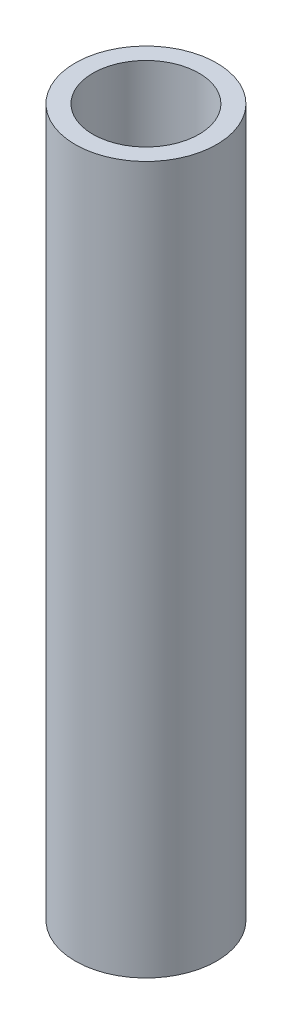
ISO-10303-21;
HEADER;
FILE_DESCRIPTION(('STEP AP214'),'2;1');
FILE_NAME('part.step','',(''),(''),'','','');
FILE_SCHEMA(('AUTOMOTIVE_DESIGN { 1 0 10303 214 1 1 1 1 }'));
ENDSEC;
DATA;
#1=APPLICATION_CONTEXT('core data for automotive mechanical design processes');
#2=APPLICATION_PROTOCOL_DEFINITION('international standard','automotive_design',2000,#1);
#3=PRODUCT_CONTEXT('',#1,'mechanical');
#4=PRODUCT('Part','Part','',(#3));
#5=PRODUCT_RELATED_PRODUCT_CATEGORY('part','',(#4));
#6=PRODUCT_DEFINITION_FORMATION('','',#4);
#7=PRODUCT_DEFINITION_CONTEXT('part definition',#1,'design');
#8=PRODUCT_DEFINITION('design','',#6,#7);
#9=PRODUCT_DEFINITION_SHAPE('','',#8);
#10=(LENGTH_UNIT() NAMED_UNIT(*) SI_UNIT(.MILLI.,.METRE.));
#11=(NAMED_UNIT(*) PLANE_ANGLE_UNIT() SI_UNIT($,.RADIAN.));
#12=(NAMED_UNIT(*) SI_UNIT($,.STERADIAN.) SOLID_ANGLE_UNIT());
#13=UNCERTAINTY_MEASURE_WITH_UNIT(LENGTH_MEASURE(1.E-05),#10,'distance_accuracy_value','');
#14=(GEOMETRIC_REPRESENTATION_CONTEXT(3) GLOBAL_UNCERTAINTY_ASSIGNED_CONTEXT((#13)) GLOBAL_UNIT_ASSIGNED_CONTEXT((#10,
#11,#12)) REPRESENTATION_CONTEXT('',''));
#15=CARTESIAN_POINT('',(0.,0.,0.));
#16=DIRECTION('',(0.,0.,1.));
#17=DIRECTION('',(1.,0.,0.));
#18=AXIS2_PLACEMENT_3D('',#15,#16,#17);
#19=CARTESIAN_POINT('',(0.,40.,0.));
#20=DIRECTION('',(0.,1.,0.));
#21=DIRECTION('',(0.,0.,1.));
#22=AXIS2_PLACEMENT_3D('',#19,#20,#21);
#23=PLANE('',#22);
#24=CARTESIAN_POINT('',(0.,40.,0.));
#25=DIRECTION('',(0.,1.,0.));
#26=DIRECTION('',(0.,0.,1.));
#27=AXIS2_PLACEMENT_3D('',#24,#25,#26);
#28=CIRCLE('',#27,4.);
#29=CARTESIAN_POINT('',(0.,40.,4.));
#30=VERTEX_POINT('',#29);
#31=EDGE_CURVE('E10',#30,#30,#28,.T.);
#32=ORIENTED_EDGE('',*,*,#31,.T.);
#33=EDGE_LOOP('',(#32));
#34=FACE_BOUND('',#33,.T.);
#35=CARTESIAN_POINT('',(0.,40.,0.));
#36=DIRECTION('',(0.,1.,0.));
#37=DIRECTION('',(0.,0.,1.));
#38=AXIS2_PLACEMENT_3D('',#35,#36,#37);
#39=CIRCLE('',#38,3.);
#40=CARTESIAN_POINT('',(0.,40.,3.));
#41=VERTEX_POINT('',#40);
#42=EDGE_CURVE('E44',#41,#41,#39,.T.);
#43=ORIENTED_EDGE('',*,*,#42,.F.);
#44=EDGE_LOOP('',(#43));
#45=FACE_BOUND('',#44,.T.);
#46=ADVANCED_FACE('F33',(#34,#45),#23,.T.);
#47=CARTESIAN_POINT('',(0.,0.,0.));
#48=DIRECTION('',(0.,1.,0.));
#49=DIRECTION('',(0.,0.,1.));
#50=AXIS2_PLACEMENT_3D('',#47,#48,#49);
#51=PLANE('',#50);
#52=CARTESIAN_POINT('',(0.,0.,0.));
#53=DIRECTION('',(0.,1.,0.));
#54=DIRECTION('',(0.,0.,1.));
#55=AXIS2_PLACEMENT_3D('',#52,#53,#54);
#56=CIRCLE('',#55,4.);
#57=CARTESIAN_POINT('',(0.,0.,4.));
#58=VERTEX_POINT('',#57);
#59=EDGE_CURVE('E37',#58,#58,#56,.T.);
#60=ORIENTED_EDGE('',*,*,#59,.F.);
#61=EDGE_LOOP('',(#60));
#62=FACE_BOUND('',#61,.T.);
#63=CARTESIAN_POINT('',(0.,0.,0.));
#64=DIRECTION('',(0.,1.,0.));
#65=DIRECTION('',(0.,0.,1.));
#66=AXIS2_PLACEMENT_3D('',#63,#64,#65);
#67=CIRCLE('',#66,3.);
#68=CARTESIAN_POINT('',(0.,0.,3.));
#69=VERTEX_POINT('',#68);
#70=EDGE_CURVE('E46',#69,#69,#67,.T.);
#71=ORIENTED_EDGE('',*,*,#70,.T.);
#72=EDGE_LOOP('',(#71));
#73=FACE_BOUND('',#72,.T.);
#74=ADVANCED_FACE('F56',(#62,#73),#51,.F.);
#75=CARTESIAN_POINT('',(0.,40.,0.));
#76=DIRECTION('',(0.,-1.,0.));
#77=DIRECTION('',(0.,0.,-1.));
#78=AXIS2_PLACEMENT_3D('',#75,#76,#77);
#79=CYLINDRICAL_SURFACE('',#78,4.);
#80=ORIENTED_EDGE('',*,*,#31,.F.);
#81=EDGE_LOOP('',(#80));
#82=FACE_BOUND('',#81,.T.);
#83=ORIENTED_EDGE('',*,*,#59,.T.);
#84=EDGE_LOOP('',(#83));
#85=FACE_BOUND('',#84,.T.);
#86=ADVANCED_FACE('F35',(#82,#85),#79,.T.);
#87=CARTESIAN_POINT('',(0.,40.,0.));
#88=DIRECTION('',(0.,-1.,0.));
#89=DIRECTION('',(0.,0.,-1.));
#90=AXIS2_PLACEMENT_3D('',#87,#88,#89);
#91=CYLINDRICAL_SURFACE('',#90,3.);
#92=ORIENTED_EDGE('',*,*,#42,.T.);
#93=EDGE_LOOP('',(#92));
#94=FACE_BOUND('',#93,.T.);
#95=ORIENTED_EDGE('',*,*,#70,.F.);
#96=EDGE_LOOP('',(#95));
#97=FACE_BOUND('',#96,.T.);
#98=ADVANCED_FACE('F52',(#94,#97),#91,.F.);
#99=CLOSED_SHELL('',(#46,#74,#86,#98));
#100=MANIFOLD_SOLID_BREP('B2',#99);
#101=ADVANCED_BREP_SHAPE_REPRESENTATION('',(#18,#100),#14);
#102=SHAPE_DEFINITION_REPRESENTATION(#9,#101);
ENDSEC;
END-ISO-10303-21;
